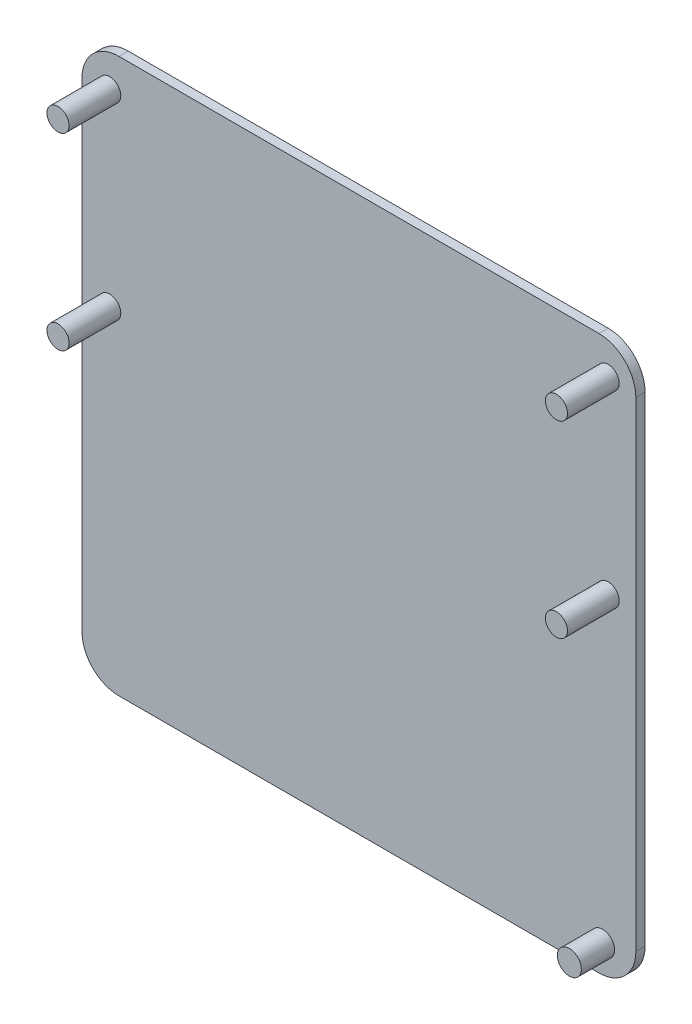
ISO-10303-21;
HEADER;
FILE_DESCRIPTION(('STEP AP214'),'2;1');
FILE_NAME('part.step','',(''),(''),'','','');
FILE_SCHEMA(('AUTOMOTIVE_DESIGN { 1 0 10303 214 1 1 1 1 }'));
ENDSEC;
DATA;
#1=APPLICATION_CONTEXT('core data for automotive mechanical design processes');
#2=APPLICATION_PROTOCOL_DEFINITION('international standard','automotive_design',2000,#1);
#3=PRODUCT_CONTEXT('',#1,'mechanical');
#4=PRODUCT('Part','Part','',(#3));
#5=PRODUCT_RELATED_PRODUCT_CATEGORY('part','',(#4));
#6=PRODUCT_DEFINITION_FORMATION('','',#4);
#7=PRODUCT_DEFINITION_CONTEXT('part definition',#1,'design');
#8=PRODUCT_DEFINITION('design','',#6,#7);
#9=PRODUCT_DEFINITION_SHAPE('','',#8);
#10=(LENGTH_UNIT() NAMED_UNIT(*) SI_UNIT(.MILLI.,.METRE.));
#11=(NAMED_UNIT(*) PLANE_ANGLE_UNIT() SI_UNIT($,.RADIAN.));
#12=(NAMED_UNIT(*) SI_UNIT($,.STERADIAN.) SOLID_ANGLE_UNIT());
#13=UNCERTAINTY_MEASURE_WITH_UNIT(LENGTH_MEASURE(1.E-05),#10,'distance_accuracy_value','');
#14=(GEOMETRIC_REPRESENTATION_CONTEXT(3) GLOBAL_UNCERTAINTY_ASSIGNED_CONTEXT((#13)) GLOBAL_UNIT_ASSIGNED_CONTEXT((#10,
#11,#12)) REPRESENTATION_CONTEXT('',''));
#15=CARTESIAN_POINT('',(0.,0.,0.));
#16=DIRECTION('',(0.,0.,1.));
#17=DIRECTION('',(1.,0.,0.));
#18=AXIS2_PLACEMENT_3D('',#15,#16,#17);
#19=CARTESIAN_POINT('',(-50.2334919640022,34.0556951463922,2.5));
#20=DIRECTION('',(0.,0.,-1.));
#21=DIRECTION('',(-1.,0.,0.));
#22=AXIS2_PLACEMENT_3D('',#19,#20,#21);
#23=CYLINDRICAL_SURFACE('',#22,9.99999999999999);
#24=CARTESIAN_POINT('',(-50.2334919640022,34.0556951463922,0.));
#25=DIRECTION('',(0.,0.,1.));
#26=DIRECTION('',(-1.,0.,0.));
#27=AXIS2_PLACEMENT_3D('',#24,#25,#26);
#28=CIRCLE('',#27,9.99999999999999);
#29=CARTESIAN_POINT('',(-50.2334919640021,44.0556951463922,0.));
#30=VERTEX_POINT('',#29);
#31=CARTESIAN_POINT('',(-60.2334919640022,34.0556951463921,0.));
#32=VERTEX_POINT('',#31);
#33=EDGE_CURVE('E147',#30,#32,#28,.T.);
#34=ORIENTED_EDGE('',*,*,#33,.T.);
#35=DIRECTION('',(0.,0.,-1.));
#36=VECTOR('',#35,1.);
#37=CARTESIAN_POINT('',(-60.2334919640022,34.0556951463921,2.5));
#38=LINE('',#37,#36);
#39=CARTESIAN_POINT('',(-60.2334919640022,34.0556951463921,2.5));
#40=VERTEX_POINT('',#39);
#41=EDGE_CURVE('E189',#40,#32,#38,.T.);
#42=ORIENTED_EDGE('',*,*,#41,.F.);
#43=CARTESIAN_POINT('',(-50.2334919640022,34.0556951463922,2.5));
#44=DIRECTION('',(0.,0.,1.));
#45=DIRECTION('',(-1.,0.,0.));
#46=AXIS2_PLACEMENT_3D('',#43,#44,#45);
#47=CIRCLE('',#46,9.99999999999999);
#48=CARTESIAN_POINT('',(-50.2334919640021,44.0556951463922,2.5));
#49=VERTEX_POINT('',#48);
#50=EDGE_CURVE('E170',#49,#40,#47,.T.);
#51=ORIENTED_EDGE('',*,*,#50,.F.);
#52=DIRECTION('',(0.,0.,-1.));
#53=VECTOR('',#52,1.);
#54=CARTESIAN_POINT('',(-50.2334919640021,44.0556951463922,2.5));
#55=LINE('',#54,#53);
#56=EDGE_CURVE('E143',#49,#30,#55,.T.);
#57=ORIENTED_EDGE('',*,*,#56,.T.);
#58=EDGE_LOOP('',(#34,#42,#51,#57));
#59=FACE_BOUND('',#58,.T.);
#60=ADVANCED_FACE('F45',(#59),#23,.T.);
#61=CARTESIAN_POINT('',(-60.2334919640022,34.0556951463921,2.5));
#62=DIRECTION('',(1.,0.,0.));
#63=DIRECTION('',(0.,1.,0.));
#64=AXIS2_PLACEMENT_3D('',#61,#62,#63);
#65=PLANE('',#64);
#66=DIRECTION('',(0.,-1.,0.));
#67=VECTOR('',#66,1.);
#68=CARTESIAN_POINT('',(-60.2334919640022,34.0556951463921,0.));
#69=LINE('',#68,#67);
#70=CARTESIAN_POINT('',(-60.2334919640022,-95.9443048536077,0.));
#71=VERTEX_POINT('',#70);
#72=EDGE_CURVE('E151',#32,#71,#69,.T.);
#73=ORIENTED_EDGE('',*,*,#72,.T.);
#74=DIRECTION('',(0.,0.,-1.));
#75=VECTOR('',#74,1.);
#76=CARTESIAN_POINT('',(-60.2334919640022,-95.9443048536077,2.5));
#77=LINE('',#76,#75);
#78=CARTESIAN_POINT('',(-60.2334919640022,-95.9443048536077,2.5));
#79=VERTEX_POINT('',#78);
#80=EDGE_CURVE('E185',#79,#71,#77,.T.);
#81=ORIENTED_EDGE('',*,*,#80,.F.);
#82=DIRECTION('',(0.,-1.,0.));
#83=VECTOR('',#82,1.);
#84=CARTESIAN_POINT('',(-60.2334919640022,34.0556951463921,2.5));
#85=LINE('',#84,#83);
#86=EDGE_CURVE('E106',#40,#79,#85,.T.);
#87=ORIENTED_EDGE('',*,*,#86,.F.);
#88=ORIENTED_EDGE('',*,*,#41,.T.);
#89=EDGE_LOOP('',(#73,#81,#87,#88));
#90=FACE_BOUND('',#89,.T.);
#91=ADVANCED_FACE('F237',(#90),#65,.F.);
#92=CARTESIAN_POINT('',(-50.2334919640022,-95.9443048536078,2.5));
#93=DIRECTION('',(0.,0.,-1.));
#94=DIRECTION('',(-1.,0.,0.));
#95=AXIS2_PLACEMENT_3D('',#92,#93,#94);
#96=CYLINDRICAL_SURFACE('',#95,10.);
#97=CARTESIAN_POINT('',(-50.2334919640022,-95.9443048536078,0.));
#98=DIRECTION('',(0.,0.,1.));
#99=DIRECTION('',(-1.,0.,0.));
#100=AXIS2_PLACEMENT_3D('',#97,#98,#99);
#101=CIRCLE('',#100,10.);
#102=CARTESIAN_POINT('',(-50.2334919640021,-105.944304853608,0.));
#103=VERTEX_POINT('',#102);
#104=EDGE_CURVE('E155',#71,#103,#101,.T.);
#105=ORIENTED_EDGE('',*,*,#104,.T.);
#106=DIRECTION('',(0.,0.,-1.));
#107=VECTOR('',#106,1.);
#108=CARTESIAN_POINT('',(-50.2334919640021,-105.944304853608,2.5));
#109=LINE('',#108,#107);
#110=CARTESIAN_POINT('',(-50.2334919640021,-105.944304853608,2.5));
#111=VERTEX_POINT('',#110);
#112=EDGE_CURVE('E181',#111,#103,#109,.T.);
#113=ORIENTED_EDGE('',*,*,#112,.F.);
#114=CARTESIAN_POINT('',(-50.2334919640022,-95.9443048536078,2.5));
#115=DIRECTION('',(0.,0.,1.));
#116=DIRECTION('',(-1.,0.,0.));
#117=AXIS2_PLACEMENT_3D('',#114,#115,#116);
#118=CIRCLE('',#117,10.);
#119=EDGE_CURVE('E251',#79,#111,#118,.T.);
#120=ORIENTED_EDGE('',*,*,#119,.F.);
#121=ORIENTED_EDGE('',*,*,#80,.T.);
#122=EDGE_LOOP('',(#105,#113,#120,#121));
#123=FACE_BOUND('',#122,.T.);
#124=ADVANCED_FACE('F242',(#123),#96,.T.);
#125=CARTESIAN_POINT('',(-50.2334919640021,-105.944304853608,2.5));
#126=DIRECTION('',(0.,1.,0.));
#127=DIRECTION('',(0.,0.,1.));
#128=AXIS2_PLACEMENT_3D('',#125,#126,#127);
#129=PLANE('',#128);
#130=DIRECTION('',(1.,0.,0.));
#131=VECTOR('',#130,1.);
#132=CARTESIAN_POINT('',(-50.2334919640021,-105.944304853608,0.));
#133=LINE('',#132,#131);
#134=CARTESIAN_POINT('',(79.7665080359977,-105.944304853608,0.));
#135=VERTEX_POINT('',#134);
#136=EDGE_CURVE('E158',#103,#135,#133,.T.);
#137=ORIENTED_EDGE('',*,*,#136,.T.);
#138=DIRECTION('',(0.,0.,-1.));
#139=VECTOR('',#138,1.);
#140=CARTESIAN_POINT('',(79.7665080359977,-105.944304853608,2.5));
#141=LINE('',#140,#139);
#142=CARTESIAN_POINT('',(79.7665080359977,-105.944304853608,2.5));
#143=VERTEX_POINT('',#142);
#144=EDGE_CURVE('E177',#143,#135,#141,.T.);
#145=ORIENTED_EDGE('',*,*,#144,.F.);
#146=DIRECTION('',(1.,0.,0.));
#147=VECTOR('',#146,1.);
#148=CARTESIAN_POINT('',(-50.2334919640021,-105.944304853608,2.5));
#149=LINE('',#148,#147);
#150=EDGE_CURVE('E254',#111,#143,#149,.T.);
#151=ORIENTED_EDGE('',*,*,#150,.F.);
#152=ORIENTED_EDGE('',*,*,#112,.T.);
#153=EDGE_LOOP('',(#137,#145,#151,#152));
#154=FACE_BOUND('',#153,.T.);
#155=ADVANCED_FACE('F412',(#154),#129,.F.);
#156=CARTESIAN_POINT('',(79.7665080359978,-95.9443048536078,2.5));
#157=DIRECTION('',(0.,0.,-1.));
#158=DIRECTION('',(-1.,0.,0.));
#159=AXIS2_PLACEMENT_3D('',#156,#157,#158);
#160=CYLINDRICAL_SURFACE('',#159,9.99999999999999);
#161=CARTESIAN_POINT('',(79.7665080359978,-95.9443048536078,0.));
#162=DIRECTION('',(0.,0.,1.));
#163=DIRECTION('',(1.,0.,0.));
#164=AXIS2_PLACEMENT_3D('',#161,#162,#163);
#165=CIRCLE('',#164,9.99999999999999);
#166=CARTESIAN_POINT('',(89.7665080359978,-95.9443048536078,0.));
#167=VERTEX_POINT('',#166);
#168=EDGE_CURVE('E161',#135,#167,#165,.T.);
#169=ORIENTED_EDGE('',*,*,#168,.T.);
#170=DIRECTION('',(0.,0.,-1.));
#171=VECTOR('',#170,1.);
#172=CARTESIAN_POINT('',(89.7665080359978,-95.9443048536078,2.5));
#173=LINE('',#172,#171);
#174=CARTESIAN_POINT('',(89.7665080359978,-95.9443048536078,2.5));
#175=VERTEX_POINT('',#174);
#176=EDGE_CURVE('E136',#175,#167,#173,.T.);
#177=ORIENTED_EDGE('',*,*,#176,.F.);
#178=CARTESIAN_POINT('',(79.7665080359978,-95.9443048536078,2.5));
#179=DIRECTION('',(0.,0.,1.));
#180=DIRECTION('',(1.,0.,0.));
#181=AXIS2_PLACEMENT_3D('',#178,#179,#180);
#182=CIRCLE('',#181,9.99999999999999);
#183=EDGE_CURVE('E125',#143,#175,#182,.T.);
#184=ORIENTED_EDGE('',*,*,#183,.F.);
#185=ORIENTED_EDGE('',*,*,#144,.T.);
#186=EDGE_LOOP('',(#169,#177,#184,#185));
#187=FACE_BOUND('',#186,.T.);
#188=ADVANCED_FACE('F404',(#187),#160,.T.);
#189=CARTESIAN_POINT('',(89.7665080359978,34.0556951463921,2.5));
#190=DIRECTION('',(-1.,0.,0.));
#191=DIRECTION('',(0.,-1.,0.));
#192=AXIS2_PLACEMENT_3D('',#189,#190,#191);
#193=PLANE('',#192);
#194=DIRECTION('',(0.,1.,0.));
#195=VECTOR('',#194,1.);
#196=CARTESIAN_POINT('',(89.7665080359978,34.0556951463921,0.));
#197=LINE('',#196,#195);
#198=CARTESIAN_POINT('',(89.7665080359978,34.0556951463921,0.));
#199=VERTEX_POINT('',#198);
#200=EDGE_CURVE('E134',#167,#199,#197,.T.);
#201=ORIENTED_EDGE('',*,*,#200,.T.);
#202=DIRECTION('',(0.,0.,-1.));
#203=VECTOR('',#202,1.);
#204=CARTESIAN_POINT('',(89.7665080359978,34.0556951463921,2.5));
#205=LINE('',#204,#203);
#206=CARTESIAN_POINT('',(89.7665080359978,34.0556951463921,2.5));
#207=VERTEX_POINT('',#206);
#208=EDGE_CURVE('E131',#207,#199,#205,.T.);
#209=ORIENTED_EDGE('',*,*,#208,.F.);
#210=DIRECTION('',(0.,1.,0.));
#211=VECTOR('',#210,1.);
#212=CARTESIAN_POINT('',(89.7665080359978,34.0556951463921,2.5));
#213=LINE('',#212,#211);
#214=EDGE_CURVE('E119',#175,#207,#213,.T.);
#215=ORIENTED_EDGE('',*,*,#214,.F.);
#216=ORIENTED_EDGE('',*,*,#176,.T.);
#217=EDGE_LOOP('',(#201,#209,#215,#216));
#218=FACE_BOUND('',#217,.T.);
#219=ADVANCED_FACE('F132',(#218),#193,.F.);
#220=CARTESIAN_POINT('',(79.7665080359978,34.0556951463922,2.5));
#221=DIRECTION('',(0.,0.,-1.));
#222=DIRECTION('',(-1.,0.,0.));
#223=AXIS2_PLACEMENT_3D('',#220,#221,#222);
#224=CYLINDRICAL_SURFACE('',#223,10.);
#225=CARTESIAN_POINT('',(79.7665080359978,34.0556951463922,0.));
#226=DIRECTION('',(0.,0.,1.));
#227=DIRECTION('',(1.,0.,0.));
#228=AXIS2_PLACEMENT_3D('',#225,#226,#227);
#229=CIRCLE('',#228,10.);
#230=CARTESIAN_POINT('',(79.7665080359977,44.0556951463922,0.));
#231=VERTEX_POINT('',#230);
#232=EDGE_CURVE('E91',#199,#231,#229,.T.);
#233=ORIENTED_EDGE('',*,*,#232,.T.);
#234=DIRECTION('',(0.,0.,-1.));
#235=VECTOR('',#234,1.);
#236=CARTESIAN_POINT('',(79.7665080359977,44.0556951463922,2.5));
#237=LINE('',#236,#235);
#238=CARTESIAN_POINT('',(79.7665080359977,44.0556951463922,2.5));
#239=VERTEX_POINT('',#238);
#240=EDGE_CURVE('E137',#239,#231,#237,.T.);
#241=ORIENTED_EDGE('',*,*,#240,.F.);
#242=CARTESIAN_POINT('',(79.7665080359978,34.0556951463922,2.5));
#243=DIRECTION('',(0.,0.,1.));
#244=DIRECTION('',(1.,0.,0.));
#245=AXIS2_PLACEMENT_3D('',#242,#243,#244);
#246=CIRCLE('',#245,10.);
#247=EDGE_CURVE('E123',#207,#239,#246,.T.);
#248=ORIENTED_EDGE('',*,*,#247,.F.);
#249=ORIENTED_EDGE('',*,*,#208,.T.);
#250=EDGE_LOOP('',(#233,#241,#248,#249));
#251=FACE_BOUND('',#250,.T.);
#252=ADVANCED_FACE('F139',(#251),#224,.T.);
#253=CARTESIAN_POINT('',(-50.2334919640021,44.0556951463922,2.5));
#254=DIRECTION('',(0.,-1.,0.));
#255=DIRECTION('',(0.,0.,-1.));
#256=AXIS2_PLACEMENT_3D('',#253,#254,#255);
#257=PLANE('',#256);
#258=DIRECTION('',(-1.,0.,0.));
#259=VECTOR('',#258,1.);
#260=CARTESIAN_POINT('',(-50.2334919640021,44.0556951463922,0.));
#261=LINE('',#260,#259);
#262=EDGE_CURVE('E97',#231,#30,#261,.T.);
#263=ORIENTED_EDGE('',*,*,#262,.T.);
#264=ORIENTED_EDGE('',*,*,#56,.F.);
#265=DIRECTION('',(-1.,0.,0.));
#266=VECTOR('',#265,1.);
#267=CARTESIAN_POINT('',(-50.2334919640021,44.0556951463922,2.5));
#268=LINE('',#267,#266);
#269=EDGE_CURVE('E62',#239,#49,#268,.T.);
#270=ORIENTED_EDGE('',*,*,#269,.F.);
#271=ORIENTED_EDGE('',*,*,#240,.T.);
#272=EDGE_LOOP('',(#263,#264,#270,#271));
#273=FACE_BOUND('',#272,.T.);
#274=ADVANCED_FACE('F212',(#273),#257,.F.);
#275=CARTESIAN_POINT('',(-50.2334919640022,34.0556951463922,2.5));
#276=DIRECTION('',(0.,0.,-1.));
#277=DIRECTION('',(-1.,0.,0.));
#278=AXIS2_PLACEMENT_3D('',#275,#276,#277);
#279=PLANE('',#278);
#280=CARTESIAN_POINT('',(80.7665080359978,-98.4443048536078,2.5));
#281=DIRECTION('',(0.,0.,-1.));
#282=DIRECTION('',(-1.,0.,0.));
#283=AXIS2_PLACEMENT_3D('',#280,#281,#282);
#284=CIRCLE('',#283,3.25000000000001);
#285=CARTESIAN_POINT('',(77.5165080359978,-98.4443048536078,2.5));
#286=VERTEX_POINT('',#285);
#287=EDGE_CURVE('E11',#286,#286,#284,.F.);
#288=ORIENTED_EDGE('',*,*,#287,.F.);
#289=EDGE_LOOP('',(#288));
#290=FACE_BOUND('',#289,.T.);
#291=CARTESIAN_POINT('',(82.2665080359978,35.0556951463922,2.5));
#292=DIRECTION('',(0.,0.,-1.));
#293=DIRECTION('',(-1.,0.,0.));
#294=AXIS2_PLACEMENT_3D('',#291,#292,#293);
#295=CIRCLE('',#294,2.99999999999999);
#296=CARTESIAN_POINT('',(79.2665080359978,35.0556951463922,2.5));
#297=VERTEX_POINT('',#296);
#298=EDGE_CURVE('E54',#297,#297,#295,.F.);
#299=ORIENTED_EDGE('',*,*,#298,.F.);
#300=EDGE_LOOP('',(#299));
#301=FACE_BOUND('',#300,.T.);
#302=CARTESIAN_POINT('',(82.2665080359978,-15.9443048536078,2.5));
#303=DIRECTION('',(0.,0.,-1.));
#304=DIRECTION('',(-1.,0.,0.));
#305=AXIS2_PLACEMENT_3D('',#302,#303,#304);
#306=CIRCLE('',#305,2.99999999999999);
#307=CARTESIAN_POINT('',(79.2665080359978,-15.9443048536078,2.5));
#308=VERTEX_POINT('',#307);
#309=EDGE_CURVE('E200',#308,#308,#306,.F.);
#310=ORIENTED_EDGE('',*,*,#309,.F.);
#311=EDGE_LOOP('',(#310));
#312=FACE_BOUND('',#311,.T.);
#313=CARTESIAN_POINT('',(-52.7334919640022,-15.9443048536078,2.5));
#314=DIRECTION('',(0.,0.,-1.));
#315=DIRECTION('',(-1.,0.,0.));
#316=AXIS2_PLACEMENT_3D('',#313,#314,#315);
#317=CIRCLE('',#316,3.);
#318=CARTESIAN_POINT('',(-55.7334919640022,-15.9443048536078,2.5));
#319=VERTEX_POINT('',#318);
#320=EDGE_CURVE('E196',#319,#319,#317,.F.);
#321=ORIENTED_EDGE('',*,*,#320,.F.);
#322=EDGE_LOOP('',(#321));
#323=FACE_BOUND('',#322,.T.);
#324=CARTESIAN_POINT('',(-52.7334919640022,35.0556951463922,2.5));
#325=DIRECTION('',(0.,0.,-1.));
#326=DIRECTION('',(-1.,0.,0.));
#327=AXIS2_PLACEMENT_3D('',#324,#325,#326);
#328=CIRCLE('',#327,3.);
#329=CARTESIAN_POINT('',(-55.7334919640022,35.0556951463922,2.5));
#330=VERTEX_POINT('',#329);
#331=EDGE_CURVE('E192',#330,#330,#328,.F.);
#332=ORIENTED_EDGE('',*,*,#331,.F.);
#333=EDGE_LOOP('',(#332));
#334=FACE_BOUND('',#333,.T.);
#335=ORIENTED_EDGE('',*,*,#50,.T.);
#336=ORIENTED_EDGE('',*,*,#86,.T.);
#337=ORIENTED_EDGE('',*,*,#119,.T.);
#338=ORIENTED_EDGE('',*,*,#150,.T.);
#339=ORIENTED_EDGE('',*,*,#183,.T.);
#340=ORIENTED_EDGE('',*,*,#214,.T.);
#341=ORIENTED_EDGE('',*,*,#247,.T.);
#342=ORIENTED_EDGE('',*,*,#269,.T.);
#343=EDGE_LOOP('',(#335,#336,#337,#338,#339,#340,#341,#342));
#344=FACE_BOUND('',#343,.T.);
#345=ADVANCED_FACE('F121',(#290,#301,#312,#323,#334,#344),#279,.F.);
#346=CARTESIAN_POINT('',(-50.2334919640022,34.0556951463922,0.));
#347=DIRECTION('',(0.,0.,-1.));
#348=DIRECTION('',(-1.,0.,0.));
#349=AXIS2_PLACEMENT_3D('',#346,#347,#348);
#350=PLANE('',#349);
#351=ORIENTED_EDGE('',*,*,#33,.F.);
#352=ORIENTED_EDGE('',*,*,#262,.F.);
#353=ORIENTED_EDGE('',*,*,#232,.F.);
#354=ORIENTED_EDGE('',*,*,#200,.F.);
#355=ORIENTED_EDGE('',*,*,#168,.F.);
#356=ORIENTED_EDGE('',*,*,#136,.F.);
#357=ORIENTED_EDGE('',*,*,#104,.F.);
#358=ORIENTED_EDGE('',*,*,#72,.F.);
#359=EDGE_LOOP('',(#351,#352,#353,#354,#355,#356,#357,#358));
#360=FACE_BOUND('',#359,.T.);
#361=ADVANCED_FACE('F211',(#360),#350,.T.);
#362=CARTESIAN_POINT('',(-52.7334919640022,35.0556951463922,16.5));
#363=DIRECTION('',(0.,0.,-1.));
#364=DIRECTION('',(-1.,0.,0.));
#365=AXIS2_PLACEMENT_3D('',#362,#363,#364);
#366=CYLINDRICAL_SURFACE('',#365,3.);
#367=CARTESIAN_POINT('',(-52.7334919640022,35.0556951463922,16.5));
#368=DIRECTION('',(0.,0.,1.));
#369=DIRECTION('',(1.,0.,0.));
#370=AXIS2_PLACEMENT_3D('',#367,#368,#369);
#371=CIRCLE('',#370,3.);
#372=CARTESIAN_POINT('',(-49.7334919640022,35.0556951463922,16.5));
#373=VERTEX_POINT('',#372);
#374=EDGE_CURVE('E152',#373,#373,#371,.T.);
#375=ORIENTED_EDGE('',*,*,#374,.F.);
#376=EDGE_LOOP('',(#375));
#377=FACE_BOUND('',#376,.T.);
#378=ORIENTED_EDGE('',*,*,#331,.T.);
#379=EDGE_LOOP('',(#378));
#380=FACE_BOUND('',#379,.T.);
#381=ADVANCED_FACE('F221',(#377,#380),#366,.T.);
#382=CARTESIAN_POINT('',(-52.7334919640022,35.0556951463922,16.5));
#383=DIRECTION('',(0.,0.,1.));
#384=DIRECTION('',(1.,0.,0.));
#385=AXIS2_PLACEMENT_3D('',#382,#383,#384);
#386=PLANE('',#385);
#387=ORIENTED_EDGE('',*,*,#374,.T.);
#388=EDGE_LOOP('',(#387));
#389=FACE_BOUND('',#388,.T.);
#390=ADVANCED_FACE('F223',(#389),#386,.T.);
#391=CARTESIAN_POINT('',(-52.7334919640022,-15.9443048536078,16.5));
#392=DIRECTION('',(0.,0.,-1.));
#393=DIRECTION('',(-1.,0.,0.));
#394=AXIS2_PLACEMENT_3D('',#391,#392,#393);
#395=CYLINDRICAL_SURFACE('',#394,3.);
#396=CARTESIAN_POINT('',(-52.7334919640022,-15.9443048536078,16.5));
#397=DIRECTION('',(0.,0.,1.));
#398=DIRECTION('',(1.,0.,0.));
#399=AXIS2_PLACEMENT_3D('',#396,#397,#398);
#400=CIRCLE('',#399,3.);
#401=CARTESIAN_POINT('',(-49.7334919640022,-15.9443048536078,16.5));
#402=VERTEX_POINT('',#401);
#403=EDGE_CURVE('E267',#402,#402,#400,.T.);
#404=ORIENTED_EDGE('',*,*,#403,.F.);
#405=EDGE_LOOP('',(#404));
#406=FACE_BOUND('',#405,.T.);
#407=ORIENTED_EDGE('',*,*,#320,.T.);
#408=EDGE_LOOP('',(#407));
#409=FACE_BOUND('',#408,.T.);
#410=ADVANCED_FACE('F230',(#406,#409),#395,.T.);
#411=CARTESIAN_POINT('',(-52.7334919640022,-15.9443048536078,16.5));
#412=DIRECTION('',(0.,0.,1.));
#413=DIRECTION('',(1.,0.,0.));
#414=AXIS2_PLACEMENT_3D('',#411,#412,#413);
#415=PLANE('',#414);
#416=ORIENTED_EDGE('',*,*,#403,.T.);
#417=EDGE_LOOP('',(#416));
#418=FACE_BOUND('',#417,.T.);
#419=ADVANCED_FACE('F302',(#418),#415,.T.);
#420=CARTESIAN_POINT('',(82.2665080359978,-15.9443048536078,16.5));
#421=DIRECTION('',(0.,0.,-1.));
#422=DIRECTION('',(-1.,0.,0.));
#423=AXIS2_PLACEMENT_3D('',#420,#421,#422);
#424=CYLINDRICAL_SURFACE('',#423,2.99999999999999);
#425=CARTESIAN_POINT('',(82.2665080359978,-15.9443048536078,16.5));
#426=DIRECTION('',(0.,0.,1.));
#427=DIRECTION('',(-1.,0.,0.));
#428=AXIS2_PLACEMENT_3D('',#425,#426,#427);
#429=CIRCLE('',#428,2.99999999999999);
#430=CARTESIAN_POINT('',(79.2665080359978,-15.9443048536078,16.5));
#431=VERTEX_POINT('',#430);
#432=EDGE_CURVE('E272',#431,#431,#429,.T.);
#433=ORIENTED_EDGE('',*,*,#432,.F.);
#434=EDGE_LOOP('',(#433));
#435=FACE_BOUND('',#434,.T.);
#436=ORIENTED_EDGE('',*,*,#309,.T.);
#437=EDGE_LOOP('',(#436));
#438=FACE_BOUND('',#437,.T.);
#439=ADVANCED_FACE('F306',(#435,#438),#424,.T.);
#440=CARTESIAN_POINT('',(82.2665080359978,-15.9443048536078,16.5));
#441=DIRECTION('',(0.,0.,-1.));
#442=DIRECTION('',(-1.,0.,0.));
#443=AXIS2_PLACEMENT_3D('',#440,#441,#442);
#444=PLANE('',#443);
#445=ORIENTED_EDGE('',*,*,#432,.T.);
#446=EDGE_LOOP('',(#445));
#447=FACE_BOUND('',#446,.T.);
#448=ADVANCED_FACE('F310',(#447),#444,.F.);
#449=CARTESIAN_POINT('',(82.2665080359978,35.0556951463922,16.5));
#450=DIRECTION('',(0.,0.,-1.));
#451=DIRECTION('',(-1.,0.,0.));
#452=AXIS2_PLACEMENT_3D('',#449,#450,#451);
#453=CYLINDRICAL_SURFACE('',#452,2.99999999999999);
#454=CARTESIAN_POINT('',(82.2665080359978,35.0556951463922,16.5));
#455=DIRECTION('',(0.,0.,1.));
#456=DIRECTION('',(-1.,0.,0.));
#457=AXIS2_PLACEMENT_3D('',#454,#455,#456);
#458=CIRCLE('',#457,2.99999999999999);
#459=CARTESIAN_POINT('',(79.2665080359978,35.0556951463922,16.5));
#460=VERTEX_POINT('',#459);
#461=EDGE_CURVE('E268',#460,#460,#458,.T.);
#462=ORIENTED_EDGE('',*,*,#461,.F.);
#463=EDGE_LOOP('',(#462));
#464=FACE_BOUND('',#463,.T.);
#465=ORIENTED_EDGE('',*,*,#298,.T.);
#466=EDGE_LOOP('',(#465));
#467=FACE_BOUND('',#466,.T.);
#468=ADVANCED_FACE('F207',(#464,#467),#453,.T.);
#469=CARTESIAN_POINT('',(82.2665080359978,35.0556951463922,16.5));
#470=DIRECTION('',(0.,0.,-1.));
#471=DIRECTION('',(-1.,0.,0.));
#472=AXIS2_PLACEMENT_3D('',#469,#470,#471);
#473=PLANE('',#472);
#474=ORIENTED_EDGE('',*,*,#461,.T.);
#475=EDGE_LOOP('',(#474));
#476=FACE_BOUND('',#475,.T.);
#477=ADVANCED_FACE('F289',(#476),#473,.F.);
#478=CARTESIAN_POINT('',(80.7665080359978,-98.4443048536078,11.5));
#479=DIRECTION('',(0.,0.,-1.));
#480=DIRECTION('',(-1.,0.,0.));
#481=AXIS2_PLACEMENT_3D('',#478,#479,#480);
#482=CYLINDRICAL_SURFACE('',#481,3.25000000000001);
#483=CARTESIAN_POINT('',(80.7665080359978,-98.4443048536078,11.5));
#484=DIRECTION('',(0.,0.,1.));
#485=DIRECTION('',(1.,0.,0.));
#486=AXIS2_PLACEMENT_3D('',#483,#484,#485);
#487=CIRCLE('',#486,3.25000000000001);
#488=CARTESIAN_POINT('',(84.0165080359978,-98.4443048536078,11.5));
#489=VERTEX_POINT('',#488);
#490=EDGE_CURVE('E273',#489,#489,#487,.T.);
#491=ORIENTED_EDGE('',*,*,#490,.F.);
#492=EDGE_LOOP('',(#491));
#493=FACE_BOUND('',#492,.T.);
#494=ORIENTED_EDGE('',*,*,#287,.T.);
#495=EDGE_LOOP('',(#494));
#496=FACE_BOUND('',#495,.T.);
#497=ADVANCED_FACE('F286',(#493,#496),#482,.T.);
#498=CARTESIAN_POINT('',(80.7665080359978,-98.4443048536078,11.5));
#499=DIRECTION('',(0.,0.,1.));
#500=DIRECTION('',(1.,0.,0.));
#501=AXIS2_PLACEMENT_3D('',#498,#499,#500);
#502=PLANE('',#501);
#503=ORIENTED_EDGE('',*,*,#490,.T.);
#504=EDGE_LOOP('',(#503));
#505=FACE_BOUND('',#504,.T.);
#506=ADVANCED_FACE('F284',(#505),#502,.T.);
#507=CLOSED_SHELL('',(#60,#91,#124,#155,#188,#219,#252,#274,#345,#361,#381,#390,#410,#419,#439,
#448,#468,#477,#497,#506));
#508=MANIFOLD_SOLID_BREP('B2',#507);
#509=ADVANCED_BREP_SHAPE_REPRESENTATION('',(#18,#508),#14);
#510=SHAPE_DEFINITION_REPRESENTATION(#9,#509);
ENDSEC;
END-ISO-10303-21;
